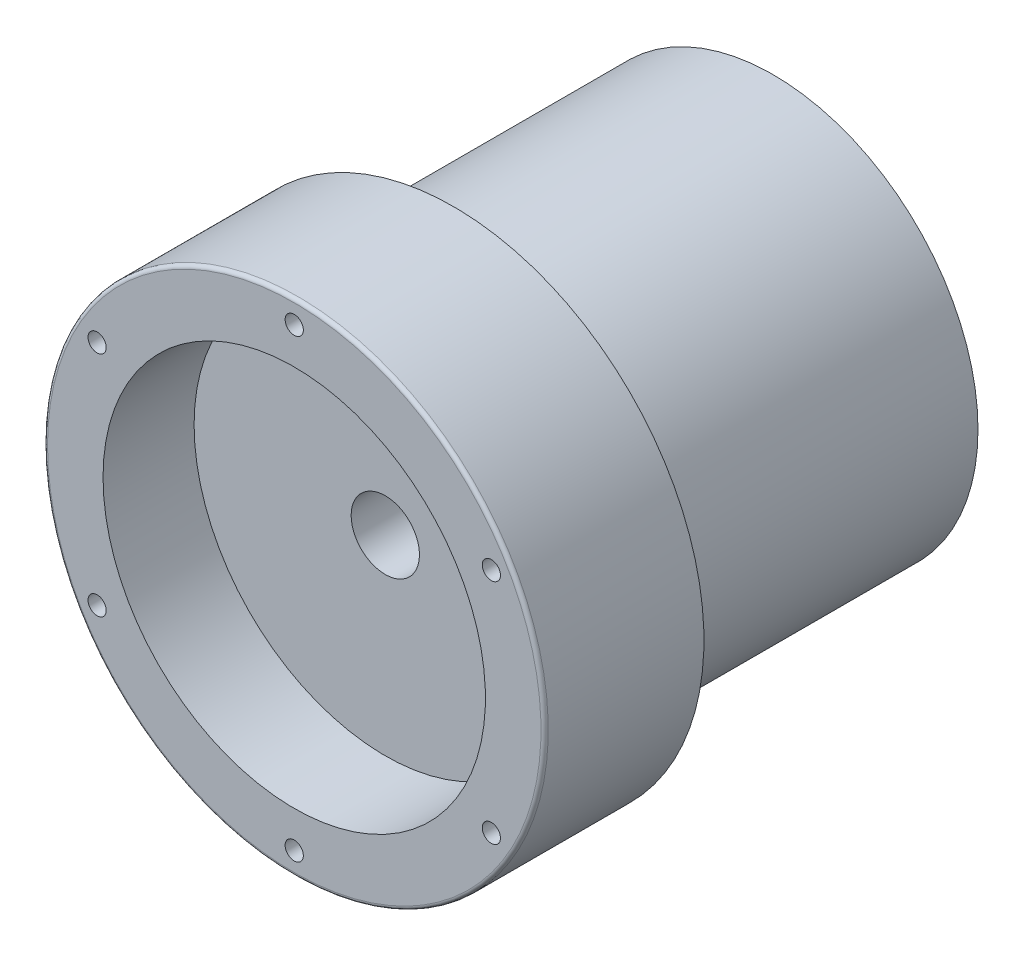
ISO-10303-21;
HEADER;
FILE_DESCRIPTION(('STEP AP214'),'2;1');
FILE_NAME('part.step','',(''),(''),'','','');
FILE_SCHEMA(('AUTOMOTIVE_DESIGN { 1 0 10303 214 1 1 1 1 }'));
ENDSEC;
DATA;
#1=APPLICATION_CONTEXT('core data for automotive mechanical design processes');
#2=APPLICATION_PROTOCOL_DEFINITION('international standard','automotive_design',2000,#1);
#3=PRODUCT_CONTEXT('',#1,'mechanical');
#4=PRODUCT('Part','Part','',(#3));
#5=PRODUCT_RELATED_PRODUCT_CATEGORY('part','',(#4));
#6=PRODUCT_DEFINITION_FORMATION('','',#4);
#7=PRODUCT_DEFINITION_CONTEXT('part definition',#1,'design');
#8=PRODUCT_DEFINITION('design','',#6,#7);
#9=PRODUCT_DEFINITION_SHAPE('','',#8);
#10=(LENGTH_UNIT() NAMED_UNIT(*) SI_UNIT(.MILLI.,.METRE.));
#11=(NAMED_UNIT(*) PLANE_ANGLE_UNIT() SI_UNIT($,.RADIAN.));
#12=(NAMED_UNIT(*) SI_UNIT($,.STERADIAN.) SOLID_ANGLE_UNIT());
#13=UNCERTAINTY_MEASURE_WITH_UNIT(LENGTH_MEASURE(1.E-05),#10,'distance_accuracy_value','');
#14=(GEOMETRIC_REPRESENTATION_CONTEXT(3) GLOBAL_UNCERTAINTY_ASSIGNED_CONTEXT((#13)) GLOBAL_UNIT_ASSIGNED_CONTEXT((#10,
#11,#12)) REPRESENTATION_CONTEXT('',''));
#15=CARTESIAN_POINT('',(0.,0.,0.));
#16=DIRECTION('',(0.,0.,1.));
#17=DIRECTION('',(1.,0.,0.));
#18=AXIS2_PLACEMENT_3D('',#15,#16,#17);
#19=CARTESIAN_POINT('',(0.,0.,0.));
#20=DIRECTION('',(0.,0.,1.));
#21=DIRECTION('',(1.,0.,0.));
#22=AXIS2_PLACEMENT_3D('',#19,#20,#21);
#23=PLANE('',#22);
#24=CARTESIAN_POINT('',(0.,0.,0.));
#25=DIRECTION('',(0.,0.,1.));
#26=DIRECTION('',(-1.,0.,0.));
#27=AXIS2_PLACEMENT_3D('',#24,#25,#26);
#28=CIRCLE('',#27,45.);
#29=CARTESIAN_POINT('',(45.,0.,0.));
#30=VERTEX_POINT('',#29);
#31=EDGE_CURVE('E10',#30,#30,#28,.T.);
#32=ORIENTED_EDGE('',*,*,#31,.T.);
#33=EDGE_LOOP('',(#32));
#34=FACE_BOUND('',#33,.T.);
#35=CARTESIAN_POINT('',(0.,50.,0.));
#36=DIRECTION('',(0.,0.,1.));
#37=DIRECTION('',(1.,0.,0.));
#38=AXIS2_PLACEMENT_3D('',#35,#36,#37);
#39=CIRCLE('',#38,2.);
#40=CARTESIAN_POINT('',(-2.,50.,0.));
#41=VERTEX_POINT('',#40);
#42=EDGE_CURVE('E145',#41,#41,#39,.T.);
#43=ORIENTED_EDGE('',*,*,#42,.T.);
#44=EDGE_LOOP('',(#43));
#45=FACE_BOUND('',#44,.T.);
#46=CARTESIAN_POINT('',(-43.3012701892219,-25.,0.));
#47=DIRECTION('',(0.,0.,1.));
#48=DIRECTION('',(1.,0.,0.));
#49=AXIS2_PLACEMENT_3D('',#46,#47,#48);
#50=CIRCLE('',#49,2.);
#51=CARTESIAN_POINT('',(-45.3012701892219,-25.,0.));
#52=VERTEX_POINT('',#51);
#53=EDGE_CURVE('E146',#52,#52,#50,.T.);
#54=ORIENTED_EDGE('',*,*,#53,.T.);
#55=EDGE_LOOP('',(#54));
#56=FACE_BOUND('',#55,.T.);
#57=CARTESIAN_POINT('',(0.,-50.,0.));
#58=DIRECTION('',(0.,0.,1.));
#59=DIRECTION('',(1.,0.,0.));
#60=AXIS2_PLACEMENT_3D('',#57,#58,#59);
#61=CIRCLE('',#60,2.);
#62=CARTESIAN_POINT('',(-2.,-50.,0.));
#63=VERTEX_POINT('',#62);
#64=EDGE_CURVE('E129',#63,#63,#61,.T.);
#65=ORIENTED_EDGE('',*,*,#64,.T.);
#66=EDGE_LOOP('',(#65));
#67=FACE_BOUND('',#66,.T.);
#68=CARTESIAN_POINT('',(43.301270189222,25.,0.));
#69=DIRECTION('',(0.,0.,1.));
#70=DIRECTION('',(1.,0.,0.));
#71=AXIS2_PLACEMENT_3D('',#68,#69,#70);
#72=CIRCLE('',#71,2.);
#73=CARTESIAN_POINT('',(41.301270189222,25.,0.));
#74=VERTEX_POINT('',#73);
#75=EDGE_CURVE('E127',#74,#74,#72,.T.);
#76=ORIENTED_EDGE('',*,*,#75,.T.);
#77=EDGE_LOOP('',(#76));
#78=FACE_BOUND('',#77,.T.);
#79=CARTESIAN_POINT('',(-43.3012701892219,25.,0.));
#80=DIRECTION('',(0.,0.,1.));
#81=DIRECTION('',(1.,0.,0.));
#82=AXIS2_PLACEMENT_3D('',#79,#80,#81);
#83=CIRCLE('',#82,2.);
#84=CARTESIAN_POINT('',(-45.3012701892219,25.,0.));
#85=VERTEX_POINT('',#84);
#86=EDGE_CURVE('E128',#85,#85,#83,.T.);
#87=ORIENTED_EDGE('',*,*,#86,.T.);
#88=EDGE_LOOP('',(#87));
#89=FACE_BOUND('',#88,.T.);
#90=CARTESIAN_POINT('',(43.3012701892219,-25.,0.));
#91=DIRECTION('',(0.,0.,1.));
#92=DIRECTION('',(1.,0.,0.));
#93=AXIS2_PLACEMENT_3D('',#90,#91,#92);
#94=CIRCLE('',#93,2.);
#95=CARTESIAN_POINT('',(41.3012701892219,-25.,0.));
#96=VERTEX_POINT('',#95);
#97=EDGE_CURVE('E135',#96,#96,#94,.T.);
#98=ORIENTED_EDGE('',*,*,#97,.T.);
#99=EDGE_LOOP('',(#98));
#100=FACE_BOUND('',#99,.T.);
#101=CARTESIAN_POINT('',(0.,0.,0.));
#102=DIRECTION('',(0.,0.,1.));
#103=DIRECTION('',(1.,0.,0.));
#104=AXIS2_PLACEMENT_3D('',#101,#102,#103);
#105=CIRCLE('',#104,55.);
#106=CARTESIAN_POINT('',(-55.,0.,0.));
#107=VERTEX_POINT('',#106);
#108=EDGE_CURVE('E149',#107,#107,#105,.T.);
#109=ORIENTED_EDGE('',*,*,#108,.F.);
#110=EDGE_LOOP('',(#109));
#111=FACE_BOUND('',#110,.T.);
#112=ADVANCED_FACE('F16',(#34,#45,#56,#67,#78,#89,#100,#111),#23,.F.);
#113=CARTESIAN_POINT('',(0.,0.,-70.2));
#114=DIRECTION('',(0.,0.,-1.));
#115=DIRECTION('',(0.,-1.,0.));
#116=AXIS2_PLACEMENT_3D('',#113,#114,#115);
#117=PLANE('',#116);
#118=CARTESIAN_POINT('',(0.,0.,-70.2));
#119=DIRECTION('',(0.,0.,1.));
#120=DIRECTION('',(1.,0.,0.));
#121=AXIS2_PLACEMENT_3D('',#118,#119,#120);
#122=CIRCLE('',#121,7.5);
#123=CARTESIAN_POINT('',(-7.5,0.,-70.2));
#124=VERTEX_POINT('',#123);
#125=EDGE_CURVE('E202',#124,#124,#122,.T.);
#126=ORIENTED_EDGE('',*,*,#125,.T.);
#127=EDGE_LOOP('',(#126));
#128=FACE_BOUND('',#127,.T.);
#129=CARTESIAN_POINT('',(0.,0.,-70.2));
#130=DIRECTION('',(0.,0.,-1.));
#131=DIRECTION('',(-1.,0.,0.));
#132=AXIS2_PLACEMENT_3D('',#129,#130,#131);
#133=CIRCLE('',#132,45.);
#134=CARTESIAN_POINT('',(45.,0.,-70.2));
#135=VERTEX_POINT('',#134);
#136=EDGE_CURVE('E160',#135,#135,#133,.T.);
#137=ORIENTED_EDGE('',*,*,#136,.T.);
#138=EDGE_LOOP('',(#137));
#139=FACE_BOUND('',#138,.T.);
#140=ADVANCED_FACE('F235',(#128,#139),#117,.T.);
#141=CARTESIAN_POINT('',(0.,0.,0.));
#142=DIRECTION('',(0.,0.,-1.));
#143=DIRECTION('',(-1.,0.,0.));
#144=AXIS2_PLACEMENT_3D('',#141,#142,#143);
#145=CYLINDRICAL_SURFACE('',#144,45.);
#146=ORIENTED_EDGE('',*,*,#136,.F.);
#147=DIRECTION('',(0.,0.,1.));
#148=VECTOR('',#147,1.);
#149=CARTESIAN_POINT('',(45.,0.,0.));
#150=LINE('',#149,#148);
#151=EDGE_CURVE('E26',#135,#30,#150,.T.);
#152=ORIENTED_EDGE('',*,*,#151,.T.);
#153=ORIENTED_EDGE('',*,*,#31,.F.);
#154=ORIENTED_EDGE('',*,*,#151,.F.);
#155=EDGE_LOOP('',(#146,#152,#153,#154));
#156=FACE_BOUND('',#155,.T.);
#157=ADVANCED_FACE('F266',(#156),#145,.T.);
#158=CARTESIAN_POINT('',(0.,0.,15.));
#159=DIRECTION('',(0.,0.,1.));
#160=DIRECTION('',(1.,0.,0.));
#161=AXIS2_PLACEMENT_3D('',#158,#159,#160);
#162=PLANE('',#161);
#163=CARTESIAN_POINT('',(0.,0.,15.));
#164=DIRECTION('',(0.,0.,-1.));
#165=DIRECTION('',(1.,0.,0.));
#166=AXIS2_PLACEMENT_3D('',#163,#164,#165);
#167=CIRCLE('',#166,7.5);
#168=CARTESIAN_POINT('',(-7.5,0.,15.));
#169=VERTEX_POINT('',#168);
#170=EDGE_CURVE('E171',#169,#169,#167,.T.);
#171=ORIENTED_EDGE('',*,*,#170,.T.);
#172=EDGE_LOOP('',(#171));
#173=FACE_BOUND('',#172,.T.);
#174=CARTESIAN_POINT('',(0.,0.,15.));
#175=DIRECTION('',(0.,0.,-1.));
#176=DIRECTION('',(1.,0.,0.));
#177=AXIS2_PLACEMENT_3D('',#174,#175,#176);
#178=CIRCLE('',#177,42.);
#179=CARTESIAN_POINT('',(-42.,0.,15.));
#180=VERTEX_POINT('',#179);
#181=EDGE_CURVE('E164',#180,#180,#178,.T.);
#182=ORIENTED_EDGE('',*,*,#181,.F.);
#183=EDGE_LOOP('',(#182));
#184=FACE_BOUND('',#183,.T.);
#185=ADVANCED_FACE('F264',(#173,#184),#162,.T.);
#186=CARTESIAN_POINT('',(0.,0.,35.));
#187=DIRECTION('',(0.,0.,-1.));
#188=DIRECTION('',(1.,0.,0.));
#189=AXIS2_PLACEMENT_3D('',#186,#187,#188);
#190=CYLINDRICAL_SURFACE('',#189,42.);
#191=CARTESIAN_POINT('',(0.,0.,35.));
#192=DIRECTION('',(0.,0.,-1.));
#193=DIRECTION('',(1.,0.,0.));
#194=AXIS2_PLACEMENT_3D('',#191,#192,#193);
#195=CIRCLE('',#194,42.);
#196=CARTESIAN_POINT('',(-42.,0.,35.));
#197=VERTEX_POINT('',#196);
#198=EDGE_CURVE('E174',#197,#197,#195,.T.);
#199=ORIENTED_EDGE('',*,*,#198,.F.);
#200=DIRECTION('',(0.,0.,-1.));
#201=VECTOR('',#200,1.);
#202=CARTESIAN_POINT('',(-42.,0.,35.));
#203=LINE('',#202,#201);
#204=EDGE_CURVE('E19',#197,#180,#203,.T.);
#205=ORIENTED_EDGE('',*,*,#204,.T.);
#206=ORIENTED_EDGE('',*,*,#181,.T.);
#207=ORIENTED_EDGE('',*,*,#204,.F.);
#208=EDGE_LOOP('',(#199,#205,#206,#207));
#209=FACE_BOUND('',#208,.T.);
#210=ADVANCED_FACE('F262',(#209),#190,.F.);
#211=CARTESIAN_POINT('',(0.,0.,15.));
#212=DIRECTION('',(0.,0.,-1.));
#213=DIRECTION('',(1.,0.,0.));
#214=AXIS2_PLACEMENT_3D('',#211,#212,#213);
#215=CYLINDRICAL_SURFACE('',#214,7.5);
#216=ORIENTED_EDGE('',*,*,#170,.F.);
#217=DIRECTION('',(0.,0.,-1.));
#218=VECTOR('',#217,1.);
#219=CARTESIAN_POINT('',(-7.5,0.,15.));
#220=LINE('',#219,#218);
#221=EDGE_CURVE('E120',#169,#124,#220,.T.);
#222=ORIENTED_EDGE('',*,*,#221,.T.);
#223=ORIENTED_EDGE('',*,*,#125,.F.);
#224=ORIENTED_EDGE('',*,*,#221,.F.);
#225=EDGE_LOOP('',(#216,#222,#223,#224));
#226=FACE_BOUND('',#225,.T.);
#227=ADVANCED_FACE('F273',(#226),#215,.F.);
#228=CARTESIAN_POINT('',(0.,50.,35.));
#229=DIRECTION('',(0.,0.,-1.));
#230=DIRECTION('',(1.,0.,0.));
#231=AXIS2_PLACEMENT_3D('',#228,#229,#230);
#232=CYLINDRICAL_SURFACE('',#231,2.);
#233=CARTESIAN_POINT('',(0.,50.,35.));
#234=DIRECTION('',(0.,0.,-1.));
#235=DIRECTION('',(1.,0.,0.));
#236=AXIS2_PLACEMENT_3D('',#233,#234,#235);
#237=CIRCLE('',#236,2.);
#238=CARTESIAN_POINT('',(-2.,50.,35.));
#239=VERTEX_POINT('',#238);
#240=EDGE_CURVE('E213',#239,#239,#237,.T.);
#241=ORIENTED_EDGE('',*,*,#240,.F.);
#242=DIRECTION('',(0.,0.,-1.));
#243=VECTOR('',#242,1.);
#244=CARTESIAN_POINT('',(-2.,50.,35.));
#245=LINE('',#244,#243);
#246=EDGE_CURVE('E141',#239,#41,#245,.T.);
#247=ORIENTED_EDGE('',*,*,#246,.T.);
#248=ORIENTED_EDGE('',*,*,#42,.F.);
#249=ORIENTED_EDGE('',*,*,#246,.F.);
#250=EDGE_LOOP('',(#241,#247,#248,#249));
#251=FACE_BOUND('',#250,.T.);
#252=ADVANCED_FACE('F228',(#251),#232,.F.);
#253=CARTESIAN_POINT('',(-43.3012701892219,-25.,35.));
#254=DIRECTION('',(0.,0.,-1.));
#255=DIRECTION('',(1.,0.,0.));
#256=AXIS2_PLACEMENT_3D('',#253,#254,#255);
#257=CYLINDRICAL_SURFACE('',#256,2.);
#258=CARTESIAN_POINT('',(-43.3012701892219,-25.,35.));
#259=DIRECTION('',(0.,0.,-1.));
#260=DIRECTION('',(1.,0.,0.));
#261=AXIS2_PLACEMENT_3D('',#258,#259,#260);
#262=CIRCLE('',#261,2.);
#263=CARTESIAN_POINT('',(-45.3012701892219,-25.,35.));
#264=VERTEX_POINT('',#263);
#265=EDGE_CURVE('E192',#264,#264,#262,.T.);
#266=ORIENTED_EDGE('',*,*,#265,.F.);
#267=DIRECTION('',(0.,0.,-1.));
#268=VECTOR('',#267,1.);
#269=CARTESIAN_POINT('',(-45.3012701892219,-25.,35.));
#270=LINE('',#269,#268);
#271=EDGE_CURVE('E133',#264,#52,#270,.T.);
#272=ORIENTED_EDGE('',*,*,#271,.T.);
#273=ORIENTED_EDGE('',*,*,#53,.F.);
#274=ORIENTED_EDGE('',*,*,#271,.F.);
#275=EDGE_LOOP('',(#266,#272,#273,#274));
#276=FACE_BOUND('',#275,.T.);
#277=ADVANCED_FACE('F435',(#276),#257,.F.);
#278=CARTESIAN_POINT('',(0.,-50.,35.));
#279=DIRECTION('',(0.,0.,-1.));
#280=DIRECTION('',(1.,0.,0.));
#281=AXIS2_PLACEMENT_3D('',#278,#279,#280);
#282=CYLINDRICAL_SURFACE('',#281,2.);
#283=CARTESIAN_POINT('',(0.,-50.,35.));
#284=DIRECTION('',(0.,0.,-1.));
#285=DIRECTION('',(1.,0.,0.));
#286=AXIS2_PLACEMENT_3D('',#283,#284,#285);
#287=CIRCLE('',#286,2.);
#288=CARTESIAN_POINT('',(-2.,-50.,35.));
#289=VERTEX_POINT('',#288);
#290=EDGE_CURVE('E156',#289,#289,#287,.T.);
#291=ORIENTED_EDGE('',*,*,#290,.F.);
#292=DIRECTION('',(0.,0.,-1.));
#293=VECTOR('',#292,1.);
#294=CARTESIAN_POINT('',(-2.,-50.,35.));
#295=LINE('',#294,#293);
#296=EDGE_CURVE('E134',#289,#63,#295,.T.);
#297=ORIENTED_EDGE('',*,*,#296,.T.);
#298=ORIENTED_EDGE('',*,*,#64,.F.);
#299=ORIENTED_EDGE('',*,*,#296,.F.);
#300=EDGE_LOOP('',(#291,#297,#298,#299));
#301=FACE_BOUND('',#300,.T.);
#302=ADVANCED_FACE('F425',(#301),#282,.F.);
#303=CARTESIAN_POINT('',(43.301270189222,25.,35.));
#304=DIRECTION('',(0.,0.,-1.));
#305=DIRECTION('',(1.,0.,0.));
#306=AXIS2_PLACEMENT_3D('',#303,#304,#305);
#307=CYLINDRICAL_SURFACE('',#306,2.);
#308=CARTESIAN_POINT('',(43.301270189222,25.,35.));
#309=DIRECTION('',(0.,0.,-1.));
#310=DIRECTION('',(1.,0.,0.));
#311=AXIS2_PLACEMENT_3D('',#308,#309,#310);
#312=CIRCLE('',#311,2.);
#313=CARTESIAN_POINT('',(41.301270189222,25.,35.));
#314=VERTEX_POINT('',#313);
#315=EDGE_CURVE('E151',#314,#314,#312,.T.);
#316=ORIENTED_EDGE('',*,*,#315,.F.);
#317=DIRECTION('',(0.,0.,-1.));
#318=VECTOR('',#317,1.);
#319=CARTESIAN_POINT('',(41.301270189222,25.,35.));
#320=LINE('',#319,#318);
#321=EDGE_CURVE('E123',#314,#74,#320,.T.);
#322=ORIENTED_EDGE('',*,*,#321,.T.);
#323=ORIENTED_EDGE('',*,*,#75,.F.);
#324=ORIENTED_EDGE('',*,*,#321,.F.);
#325=EDGE_LOOP('',(#316,#322,#323,#324));
#326=FACE_BOUND('',#325,.T.);
#327=ADVANCED_FACE('F416',(#326),#307,.F.);
#328=CARTESIAN_POINT('',(-43.3012701892219,25.,35.));
#329=DIRECTION('',(0.,0.,-1.));
#330=DIRECTION('',(1.,0.,0.));
#331=AXIS2_PLACEMENT_3D('',#328,#329,#330);
#332=CYLINDRICAL_SURFACE('',#331,2.);
#333=CARTESIAN_POINT('',(-43.3012701892219,25.,35.));
#334=DIRECTION('',(0.,0.,-1.));
#335=DIRECTION('',(1.,0.,0.));
#336=AXIS2_PLACEMENT_3D('',#333,#334,#335);
#337=CIRCLE('',#336,2.);
#338=CARTESIAN_POINT('',(-45.3012701892219,25.,35.));
#339=VERTEX_POINT('',#338);
#340=EDGE_CURVE('E155',#339,#339,#337,.T.);
#341=ORIENTED_EDGE('',*,*,#340,.F.);
#342=DIRECTION('',(0.,0.,-1.));
#343=VECTOR('',#342,1.);
#344=CARTESIAN_POINT('',(-45.3012701892219,25.,35.));
#345=LINE('',#344,#343);
#346=EDGE_CURVE('E139',#339,#85,#345,.T.);
#347=ORIENTED_EDGE('',*,*,#346,.T.);
#348=ORIENTED_EDGE('',*,*,#86,.F.);
#349=ORIENTED_EDGE('',*,*,#346,.F.);
#350=EDGE_LOOP('',(#341,#347,#348,#349));
#351=FACE_BOUND('',#350,.T.);
#352=ADVANCED_FACE('F404',(#351),#332,.F.);
#353=CARTESIAN_POINT('',(43.3012701892219,-25.,35.));
#354=DIRECTION('',(0.,0.,-1.));
#355=DIRECTION('',(1.,0.,0.));
#356=AXIS2_PLACEMENT_3D('',#353,#354,#355);
#357=CYLINDRICAL_SURFACE('',#356,2.);
#358=CARTESIAN_POINT('',(43.3012701892219,-25.,35.));
#359=DIRECTION('',(0.,0.,-1.));
#360=DIRECTION('',(1.,0.,0.));
#361=AXIS2_PLACEMENT_3D('',#358,#359,#360);
#362=CIRCLE('',#361,2.);
#363=CARTESIAN_POINT('',(41.3012701892219,-25.,35.));
#364=VERTEX_POINT('',#363);
#365=EDGE_CURVE('E181',#364,#364,#362,.T.);
#366=ORIENTED_EDGE('',*,*,#365,.F.);
#367=DIRECTION('',(0.,0.,-1.));
#368=VECTOR('',#367,1.);
#369=CARTESIAN_POINT('',(41.3012701892219,-25.,35.));
#370=LINE('',#369,#368);
#371=EDGE_CURVE('E140',#364,#96,#370,.T.);
#372=ORIENTED_EDGE('',*,*,#371,.T.);
#373=ORIENTED_EDGE('',*,*,#97,.F.);
#374=ORIENTED_EDGE('',*,*,#371,.F.);
#375=EDGE_LOOP('',(#366,#372,#373,#374));
#376=FACE_BOUND('',#375,.T.);
#377=ADVANCED_FACE('F258',(#376),#357,.F.);
#378=CARTESIAN_POINT('',(0.,0.,35.));
#379=DIRECTION('',(0.,0.,1.));
#380=DIRECTION('',(1.,0.,0.));
#381=AXIS2_PLACEMENT_3D('',#378,#379,#380);
#382=PLANE('',#381);
#383=ORIENTED_EDGE('',*,*,#365,.T.);
#384=EDGE_LOOP('',(#383));
#385=FACE_BOUND('',#384,.T.);
#386=ORIENTED_EDGE('',*,*,#340,.T.);
#387=EDGE_LOOP('',(#386));
#388=FACE_BOUND('',#387,.T.);
#389=ORIENTED_EDGE('',*,*,#315,.T.);
#390=EDGE_LOOP('',(#389));
#391=FACE_BOUND('',#390,.T.);
#392=ORIENTED_EDGE('',*,*,#290,.T.);
#393=EDGE_LOOP('',(#392));
#394=FACE_BOUND('',#393,.T.);
#395=ORIENTED_EDGE('',*,*,#265,.T.);
#396=EDGE_LOOP('',(#395));
#397=FACE_BOUND('',#396,.T.);
#398=ORIENTED_EDGE('',*,*,#240,.T.);
#399=EDGE_LOOP('',(#398));
#400=FACE_BOUND('',#399,.T.);
#401=ORIENTED_EDGE('',*,*,#198,.T.);
#402=EDGE_LOOP('',(#401));
#403=FACE_BOUND('',#402,.T.);
#404=CARTESIAN_POINT('',(0.,0.,35.));
#405=DIRECTION('',(0.,0.,-1.));
#406=DIRECTION('',(-1.,0.,0.));
#407=AXIS2_PLACEMENT_3D('',#404,#405,#406);
#408=CIRCLE('',#407,54.2);
#409=CARTESIAN_POINT('',(-54.2,0.,35.));
#410=VERTEX_POINT('',#409);
#411=EDGE_CURVE('E106',#410,#410,#408,.T.);
#412=ORIENTED_EDGE('',*,*,#411,.F.);
#413=EDGE_LOOP('',(#412));
#414=FACE_BOUND('',#413,.T.);
#415=ADVANCED_FACE('F226',(#385,#388,#391,#394,#397,#400,#403,#414),#382,.T.);
#416=CARTESIAN_POINT('',(0.,0.,0.));
#417=DIRECTION('',(0.,0.,1.));
#418=DIRECTION('',(1.,0.,0.));
#419=AXIS2_PLACEMENT_3D('',#416,#417,#418);
#420=CYLINDRICAL_SURFACE('',#419,55.);
#421=CARTESIAN_POINT('',(0.,0.,34.2));
#422=DIRECTION('',(0.,0.,1.));
#423=DIRECTION('',(-1.,0.,0.));
#424=AXIS2_PLACEMENT_3D('',#421,#422,#423);
#425=CIRCLE('',#424,55.);
#426=CARTESIAN_POINT('',(-55.,0.,34.2));
#427=VERTEX_POINT('',#426);
#428=EDGE_CURVE('E108',#427,#427,#425,.T.);
#429=ORIENTED_EDGE('',*,*,#428,.F.);
#430=DIRECTION('',(0.,0.,-1.));
#431=VECTOR('',#430,1.);
#432=CARTESIAN_POINT('',(-55.,0.,0.));
#433=LINE('',#432,#431);
#434=EDGE_CURVE('E116',#427,#107,#433,.T.);
#435=ORIENTED_EDGE('',*,*,#434,.T.);
#436=ORIENTED_EDGE('',*,*,#108,.T.);
#437=ORIENTED_EDGE('',*,*,#434,.F.);
#438=EDGE_LOOP('',(#429,#435,#436,#437));
#439=FACE_BOUND('',#438,.T.);
#440=ADVANCED_FACE('F248',(#439),#420,.T.);
#441=CARTESIAN_POINT('',(0.,0.,34.2));
#442=DIRECTION('',(0.,0.,1.));
#443=DIRECTION('',(1.,0.,0.));
#444=AXIS2_PLACEMENT_3D('',#441,#442,#443);
#445=TOROIDAL_SURFACE('',#444,54.2,0.8);
#446=ORIENTED_EDGE('',*,*,#411,.T.);
#447=CARTESIAN_POINT('',(-54.2,0.,34.2));
#448=DIRECTION('',(0.,-1.,0.));
#449=DIRECTION('',(-1.,0.,0.));
#450=AXIS2_PLACEMENT_3D('',#447,#448,#449);
#451=CIRCLE('',#450,0.8);
#452=EDGE_CURVE('E103',#410,#427,#451,.T.);
#453=ORIENTED_EDGE('',*,*,#452,.T.);
#454=ORIENTED_EDGE('',*,*,#428,.T.);
#455=ORIENTED_EDGE('',*,*,#452,.F.);
#456=EDGE_LOOP('',(#446,#453,#454,#455));
#457=FACE_BOUND('',#456,.T.);
#458=ADVANCED_FACE('F104',(#457),#445,.T.);
#459=CLOSED_SHELL('',(#112,#140,#157,#185,#210,#227,#252,#277,#302,#327,#352,#377,#415,#440,#458));
#460=MANIFOLD_SOLID_BREP('B1',#459);
#461=ADVANCED_BREP_SHAPE_REPRESENTATION('',(#18,#460),#14);
#462=SHAPE_DEFINITION_REPRESENTATION(#9,#461);
ENDSEC;
END-ISO-10303-21;
